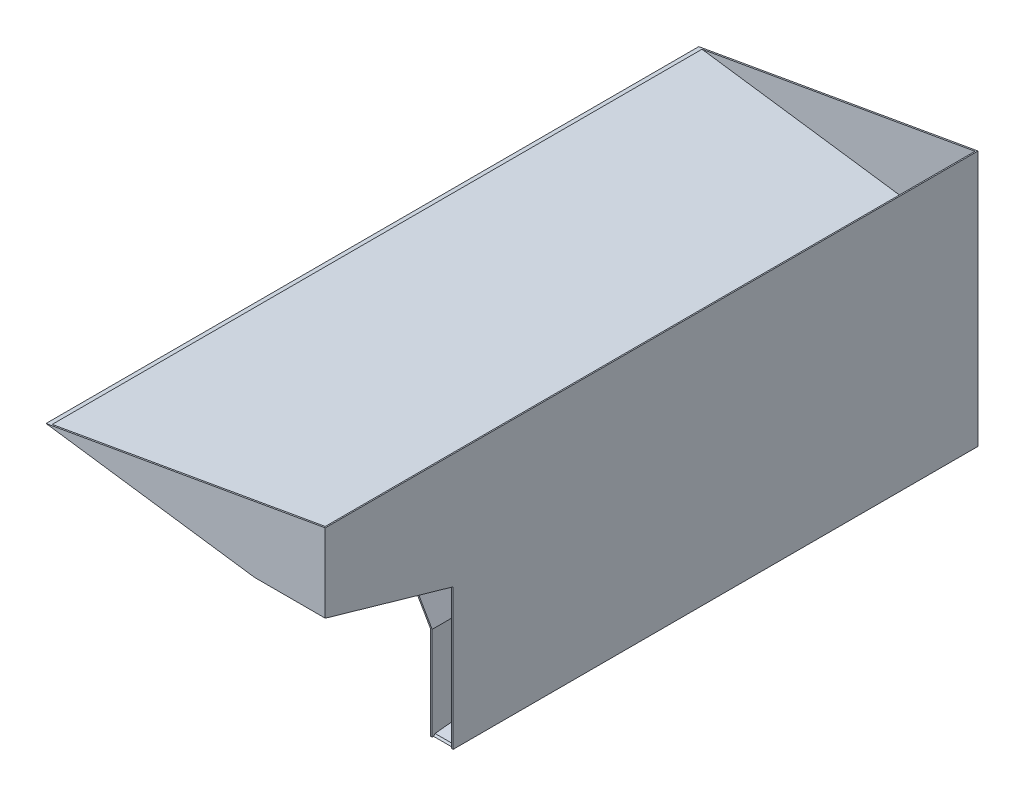
ISO-10303-21;
HEADER;
FILE_DESCRIPTION(('STEP AP214'),'2;1');
FILE_NAME('part.step','',(''),(''),'','','');
FILE_SCHEMA(('AUTOMOTIVE_DESIGN { 1 0 10303 214 1 1 1 1 }'));
ENDSEC;
DATA;
#1=APPLICATION_CONTEXT('core data for automotive mechanical design processes');
#2=APPLICATION_PROTOCOL_DEFINITION('international standard','automotive_design',2000,#1);
#3=PRODUCT_CONTEXT('',#1,'mechanical');
#4=PRODUCT('Part','Part','',(#3));
#5=PRODUCT_RELATED_PRODUCT_CATEGORY('part','',(#4));
#6=PRODUCT_DEFINITION_FORMATION('','',#4);
#7=PRODUCT_DEFINITION_CONTEXT('part definition',#1,'design');
#8=PRODUCT_DEFINITION('design','',#6,#7);
#9=PRODUCT_DEFINITION_SHAPE('','',#8);
#10=(LENGTH_UNIT() NAMED_UNIT(*) SI_UNIT(.MILLI.,.METRE.));
#11=(NAMED_UNIT(*) PLANE_ANGLE_UNIT() SI_UNIT($,.RADIAN.));
#12=(NAMED_UNIT(*) SI_UNIT($,.STERADIAN.) SOLID_ANGLE_UNIT());
#13=UNCERTAINTY_MEASURE_WITH_UNIT(LENGTH_MEASURE(1.E-05),#10,'distance_accuracy_value','');
#14=(GEOMETRIC_REPRESENTATION_CONTEXT(3) GLOBAL_UNCERTAINTY_ASSIGNED_CONTEXT((#13)) GLOBAL_UNIT_ASSIGNED_CONTEXT((#10,
#11,#12)) REPRESENTATION_CONTEXT('',''));
#15=CARTESIAN_POINT('',(0.,0.,0.));
#16=DIRECTION('',(0.,0.,1.));
#17=DIRECTION('',(1.,0.,0.));
#18=AXIS2_PLACEMENT_3D('',#15,#16,#17);
#19=CARTESIAN_POINT('',(100.,-200.,426.675));
#20=DIRECTION('',(0.,0.,-1.));
#21=DIRECTION('',(-1.,0.,0.));
#22=AXIS2_PLACEMENT_3D('',#19,#20,#21);
#23=PLANE('',#22);
#24=DIRECTION('',(-1.,0.,0.));
#25=VECTOR('',#24,1.);
#26=CARTESIAN_POINT('',(100.,-200.,426.675));
#27=LINE('',#26,#25);
#28=CARTESIAN_POINT('',(3.175,-200.,426.675));
#29=VERTEX_POINT('',#28);
#30=CARTESIAN_POINT('',(0.,-200.,426.675));
#31=VERTEX_POINT('',#30);
#32=EDGE_CURVE('E441',#29,#31,#27,.T.);
#33=ORIENTED_EDGE('',*,*,#32,.F.);
#34=DIRECTION('',(0.,1.,0.));
#35=VECTOR('',#34,1.);
#36=CARTESIAN_POINT('',(3.175,-200.,426.675));
#37=LINE('',#36,#35);
#38=CARTESIAN_POINT('',(3.175,0.850738685968816,426.675));
#39=VERTEX_POINT('',#38);
#40=EDGE_CURVE('E440',#29,#39,#37,.T.);
#41=ORIENTED_EDGE('',*,*,#40,.T.);
#42=DIRECTION('',(-0.500000000000001,0.866025403784438,0.));
#43=VECTOR('',#42,1.);
#44=CARTESIAN_POINT('',(2.74963065701559,1.5875,426.675));
#45=LINE('',#44,#43);
#46=CARTESIAN_POINT('',(-55.6276984364206,102.7,426.675));
#47=VERTEX_POINT('',#46);
#48=EDGE_CURVE('E333',#39,#47,#45,.T.);
#49=ORIENTED_EDGE('',*,*,#48,.T.);
#50=DIRECTION('',(-1.,0.,0.));
#51=VECTOR('',#50,1.);
#52=CARTESIAN_POINT('',(100.,102.7,426.675));
#53=LINE('',#52,#51);
#54=CARTESIAN_POINT('',(-59.2938726457747,102.7,426.675));
#55=VERTEX_POINT('',#54);
#56=EDGE_CURVE('E435',#47,#55,#53,.T.);
#57=ORIENTED_EDGE('',*,*,#56,.T.);
#58=DIRECTION('',(-0.500000000000001,0.866025403784438,0.));
#59=VECTOR('',#58,1.);
#60=CARTESIAN_POINT('',(0.,0.,426.675));
#61=LINE('',#60,#59);
#62=CARTESIAN_POINT('',(0.,0.,426.675));
#63=VERTEX_POINT('',#62);
#64=EDGE_CURVE('E450',#63,#55,#61,.T.);
#65=ORIENTED_EDGE('',*,*,#64,.F.);
#66=DIRECTION('',(0.,1.,0.));
#67=VECTOR('',#66,1.);
#68=CARTESIAN_POINT('',(0.,-200.,426.675));
#69=LINE('',#68,#67);
#70=EDGE_CURVE('E454',#31,#63,#69,.T.);
#71=ORIENTED_EDGE('',*,*,#70,.F.);
#72=EDGE_LOOP('',(#33,#41,#49,#57,#65,#71));
#73=FACE_BOUND('',#72,.T.);
#74=ADVANCED_FACE('F47',(#73),#23,.F.);
#75=CARTESIAN_POINT('',(0.,0.,698.5));
#76=DIRECTION('',(0.,0.,1.));
#77=DIRECTION('',(1.,0.,0.));
#78=AXIS2_PLACEMENT_3D('',#75,#76,#77);
#79=PLANE('',#78);
#80=DIRECTION('',(-1.,0.,0.));
#81=VECTOR('',#80,1.);
#82=CARTESIAN_POINT('',(0.,187.394734297147,698.5));
#83=LINE('',#82,#81);
#84=CARTESIAN_POINT('',(45.175,187.394734297147,698.5));
#85=VERTEX_POINT('',#84);
#86=CARTESIAN_POINT('',(-104.668740211988,187.394734297147,698.5));
#87=VERTEX_POINT('',#86);
#88=EDGE_CURVE('E421',#85,#87,#83,.T.);
#89=ORIENTED_EDGE('',*,*,#88,.T.);
#90=DIRECTION('',(0.0439713427708149,-0.999032792762546,0.));
#91=VECTOR('',#90,1.);
#92=CARTESIAN_POINT('',(-96.2343370929632,-4.23564977375333,698.5));
#93=LINE('',#92,#91);
#94=CARTESIAN_POINT('',(-104.563788725137,185.010227243083,698.5));
#95=VERTEX_POINT('',#94);
#96=EDGE_CURVE('E402',#87,#95,#93,.T.);
#97=ORIENTED_EDGE('',*,*,#96,.T.);
#98=DIRECTION('',(0.990432714403848,-0.137996515313345,0.));
#99=VECTOR('',#98,1.);
#100=CARTESIAN_POINT('',(-104.56186106388,185.009958662964,698.5));
#101=LINE('',#100,#99);
#102=CARTESIAN_POINT('',(-541.833243012971,245.93477069479,698.5));
#103=VERTEX_POINT('',#102);
#104=EDGE_CURVE('E247',#103,#95,#101,.T.);
#105=ORIENTED_EDGE('',*,*,#104,.F.);
#106=DIRECTION('',(-0.984807753012207,-0.173648177666935,0.));
#107=VECTOR('',#106,1.);
#108=CARTESIAN_POINT('',(-551.988806236242,244.144070894237,698.5));
#109=LINE('',#108,#107);
#110=CARTESIAN_POINT('',(45.1749999999999,349.440161836251,698.5));
#111=VERTEX_POINT('',#110);
#112=EDGE_CURVE('E257',#111,#103,#109,.T.);
#113=ORIENTED_EDGE('',*,*,#112,.F.);
#114=DIRECTION('',(0.,1.,0.));
#115=VECTOR('',#114,1.);
#116=CARTESIAN_POINT('',(45.1749999999999,350.,698.5));
#117=LINE('',#116,#115);
#118=EDGE_CURVE('E254',#85,#111,#117,.T.);
#119=ORIENTED_EDGE('',*,*,#118,.F.);
#120=EDGE_LOOP('',(#89,#97,#105,#113,#119));
#121=FACE_BOUND('',#120,.T.);
#122=ADVANCED_FACE('F534',(#121),#79,.F.);
#123=CARTESIAN_POINT('',(48.3499999999999,350.,701.675));
#124=DIRECTION('',(-1.,0.,0.));
#125=DIRECTION('',(0.,-1.,0.));
#126=AXIS2_PLACEMENT_3D('',#123,#124,#125);
#127=PLANE('',#126);
#128=DIRECTION('',(0.,-0.276105657594725,-0.961127289095562));
#129=VECTOR('',#128,1.);
#130=CARTESIAN_POINT('',(48.35,-18.3571552903526,5.27351006522856));
#131=LINE('',#130,#129);
#132=CARTESIAN_POINT('',(48.35,181.7,701.675));
#133=VERTEX_POINT('',#132);
#134=CARTESIAN_POINT('',(48.35,102.7,426.675));
#135=VERTEX_POINT('',#134);
#136=EDGE_CURVE('E424',#133,#135,#131,.T.);
#137=ORIENTED_EDGE('',*,*,#136,.T.);
#138=DIRECTION('',(0.,-1.,0.));
#139=VECTOR('',#138,1.);
#140=CARTESIAN_POINT('',(48.3499999999999,350.,426.675));
#141=LINE('',#140,#139);
#142=CARTESIAN_POINT('',(48.35,-200.,426.675));
#143=VERTEX_POINT('',#142);
#144=EDGE_CURVE('E457',#135,#143,#141,.T.);
#145=ORIENTED_EDGE('',*,*,#144,.T.);
#146=DIRECTION('',(0.,0.,-1.));
#147=VECTOR('',#146,1.);
#148=CARTESIAN_POINT('',(48.35,-200.,701.675));
#149=LINE('',#148,#147);
#150=CARTESIAN_POINT('',(48.35,-200.,-701.675));
#151=VERTEX_POINT('',#150);
#152=EDGE_CURVE('E327',#143,#151,#149,.T.);
#153=ORIENTED_EDGE('',*,*,#152,.T.);
#154=DIRECTION('',(0.,1.,0.));
#155=VECTOR('',#154,1.);
#156=CARTESIAN_POINT('',(48.3499999999999,350.,-701.675));
#157=LINE('',#156,#155);
#158=CARTESIAN_POINT('',(48.3499999999999,350.,-701.675));
#159=VERTEX_POINT('',#158);
#160=EDGE_CURVE('E301',#151,#159,#157,.T.);
#161=ORIENTED_EDGE('',*,*,#160,.T.);
#162=DIRECTION('',(0.,0.,-1.));
#163=VECTOR('',#162,1.);
#164=CARTESIAN_POINT('',(48.3499999999999,350.,701.675));
#165=LINE('',#164,#163);
#166=CARTESIAN_POINT('',(48.3499999999999,350.,701.675));
#167=VERTEX_POINT('',#166);
#168=EDGE_CURVE('E323',#167,#159,#165,.T.);
#169=ORIENTED_EDGE('',*,*,#168,.F.);
#170=DIRECTION('',(0.,1.,0.));
#171=VECTOR('',#170,1.);
#172=CARTESIAN_POINT('',(48.3499999999999,350.,701.675));
#173=LINE('',#172,#171);
#174=EDGE_CURVE('E283',#133,#167,#173,.T.);
#175=ORIENTED_EDGE('',*,*,#174,.F.);
#176=EDGE_LOOP('',(#137,#145,#153,#161,#169,#175));
#177=FACE_BOUND('',#176,.T.);
#178=ADVANCED_FACE('F514',(#177),#127,.F.);
#179=CARTESIAN_POINT('',(0.,0.,701.675));
#180=DIRECTION('',(0.866025403784438,0.500000000000001,0.));
#181=DIRECTION('',(-0.500000000000001,0.866025403784438,0.));
#182=AXIS2_PLACEMENT_3D('',#179,#180,#181);
#183=PLANE('',#182);
#184=DIRECTION('',(0.15742206253362,-0.272663010540513,-0.94914339112204));
#185=VECTOR('',#184,1.);
#186=CARTESIAN_POINT('',(-94.5056897461453,163.688656244664,638.977284395983));
#187=LINE('',#186,#185);
#188=CARTESIAN_POINT('',(-104.904543911755,181.7,701.675));
#189=VERTEX_POINT('',#188);
#190=EDGE_CURVE('E432',#189,#55,#187,.T.);
#191=ORIENTED_EDGE('',*,*,#190,.F.);
#192=DIRECTION('',(0.500000000000001,-0.866025403784438,0.));
#193=VECTOR('',#192,1.);
#194=CARTESIAN_POINT('',(0.,0.,701.675));
#195=LINE('',#194,#193);
#196=CARTESIAN_POINT('',(-105.,181.865334794732,701.675));
#197=VERTEX_POINT('',#196);
#198=EDGE_CURVE('E293',#197,#189,#195,.T.);
#199=ORIENTED_EDGE('',*,*,#198,.F.);
#200=DIRECTION('',(0.,0.,-1.));
#201=VECTOR('',#200,1.);
#202=CARTESIAN_POINT('',(-105.,181.865334794732,701.675));
#203=LINE('',#202,#201);
#204=CARTESIAN_POINT('',(-105.,181.865334794732,-701.675));
#205=VERTEX_POINT('',#204);
#206=EDGE_CURVE('E315',#197,#205,#203,.T.);
#207=ORIENTED_EDGE('',*,*,#206,.T.);
#208=DIRECTION('',(0.500000000000001,-0.866025403784438,0.));
#209=VECTOR('',#208,1.);
#210=CARTESIAN_POINT('',(0.,0.,-701.675));
#211=LINE('',#210,#209);
#212=CARTESIAN_POINT('',(0.,0.,-701.675));
#213=VERTEX_POINT('',#212);
#214=EDGE_CURVE('E287',#205,#213,#211,.T.);
#215=ORIENTED_EDGE('',*,*,#214,.T.);
#216=DIRECTION('',(0.,0.,-1.));
#217=VECTOR('',#216,1.);
#218=CARTESIAN_POINT('',(0.,0.,701.675));
#219=LINE('',#218,#217);
#220=EDGE_CURVE('E296',#63,#213,#219,.T.);
#221=ORIENTED_EDGE('',*,*,#220,.F.);
#222=ORIENTED_EDGE('',*,*,#64,.T.);
#223=EDGE_LOOP('',(#191,#199,#207,#215,#221,#222));
#224=FACE_BOUND('',#223,.T.);
#225=ADVANCED_FACE('F485',(#224),#183,.F.);
#226=CARTESIAN_POINT('',(0.,0.,701.675));
#227=DIRECTION('',(0.,0.,1.));
#228=DIRECTION('',(1.,0.,0.));
#229=AXIS2_PLACEMENT_3D('',#226,#227,#228);
#230=PLANE('',#229);
#231=ORIENTED_EDGE('',*,*,#198,.T.);
#232=DIRECTION('',(1.,0.,0.));
#233=VECTOR('',#232,1.);
#234=CARTESIAN_POINT('',(-551.988806236242,181.7,701.675));
#235=LINE('',#234,#233);
#236=EDGE_CURVE('E428',#189,#133,#235,.T.);
#237=ORIENTED_EDGE('',*,*,#236,.T.);
#238=ORIENTED_EDGE('',*,*,#174,.T.);
#239=DIRECTION('',(-0.984807753012207,-0.173648177666935,0.));
#240=VECTOR('',#239,1.);
#241=CARTESIAN_POINT('',(-551.988806236242,244.144070894237,701.675));
#242=LINE('',#241,#240);
#243=CARTESIAN_POINT('',(-551.988806236242,244.144070894237,701.675));
#244=VERTEX_POINT('',#243);
#245=EDGE_CURVE('E286',#167,#244,#242,.T.);
#246=ORIENTED_EDGE('',*,*,#245,.T.);
#247=DIRECTION('',(0.990432714403848,-0.137996515313345,0.));
#248=VECTOR('',#247,1.);
#249=CARTESIAN_POINT('',(-105.,181.865334794732,701.675));
#250=LINE('',#249,#248);
#251=EDGE_CURVE('E290',#244,#197,#250,.T.);
#252=ORIENTED_EDGE('',*,*,#251,.T.);
#253=EDGE_LOOP('',(#231,#237,#238,#246,#252));
#254=FACE_BOUND('',#253,.T.);
#255=ADVANCED_FACE('F488',(#254),#230,.T.);
#256=CARTESIAN_POINT('',(45.1749999999999,350.,701.675));
#257=DIRECTION('',(-1.,0.,0.));
#258=DIRECTION('',(0.,-1.,0.));
#259=AXIS2_PLACEMENT_3D('',#256,#257,#258);
#260=PLANE('',#259);
#261=DIRECTION('',(0.,-0.104528463267647,0.994521895368274));
#262=VECTOR('',#261,1.);
#263=CARTESIAN_POINT('',(45.175,-150.319090417385,-15.7991730441503));
#264=LINE('',#263,#262);
#265=CARTESIAN_POINT('',(45.175,-79.5654599258556,-688.975));
#266=VERTEX_POINT('',#265);
#267=CARTESIAN_POINT('',(45.175,-196.16124425825,420.359785964411));
#268=VERTEX_POINT('',#267);
#269=EDGE_CURVE('E362',#266,#268,#264,.T.);
#270=ORIENTED_EDGE('',*,*,#269,.T.);
#271=DIRECTION('',(0.,-0.777145961456969,0.62932039104984));
#272=VECTOR('',#271,1.);
#273=CARTESIAN_POINT('',(45.175,-203.959884113709,426.675));
#274=LINE('',#273,#272);
#275=CARTESIAN_POINT('',(45.175,-200.,423.468349071416));
#276=VERTEX_POINT('',#275);
#277=EDGE_CURVE('E11',#268,#276,#274,.T.);
#278=ORIENTED_EDGE('',*,*,#277,.T.);
#279=DIRECTION('',(0.,0.,-1.));
#280=VECTOR('',#279,1.);
#281=CARTESIAN_POINT('',(45.175,-200.,701.675));
#282=LINE('',#281,#280);
#283=CARTESIAN_POINT('',(45.175,-200.,426.675));
#284=VERTEX_POINT('',#283);
#285=EDGE_CURVE('E341',#284,#276,#282,.T.);
#286=ORIENTED_EDGE('',*,*,#285,.F.);
#287=DIRECTION('',(0.,-1.,0.));
#288=VECTOR('',#287,1.);
#289=CARTESIAN_POINT('',(45.1749999999999,350.,426.675));
#290=LINE('',#289,#288);
#291=CARTESIAN_POINT('',(45.175,102.7,426.675));
#292=VERTEX_POINT('',#291);
#293=EDGE_CURVE('E64',#292,#284,#290,.T.);
#294=ORIENTED_EDGE('',*,*,#293,.F.);
#295=DIRECTION('',(0.,-0.961127289095562,0.276105657594725));
#296=VECTOR('',#295,1.);
#297=CARTESIAN_POINT('',(45.175,258.169761561576,382.012777587765));
#298=LINE('',#297,#296);
#299=CARTESIAN_POINT('',(45.175,108.803158285757,424.921729074274));
#300=VERTEX_POINT('',#299);
#301=EDGE_CURVE('E409',#300,#292,#298,.T.);
#302=ORIENTED_EDGE('',*,*,#301,.F.);
#303=DIRECTION('',(0.,-0.276105657594725,-0.961127289095562));
#304=VECTOR('',#303,1.);
#305=CARTESIAN_POINT('',(45.175,200.63339672418,744.583951486508));
#306=LINE('',#305,#304);
#307=EDGE_CURVE('E417',#85,#300,#306,.T.);
#308=ORIENTED_EDGE('',*,*,#307,.F.);
#309=ORIENTED_EDGE('',*,*,#118,.T.);
#310=DIRECTION('',(0.,0.,-1.));
#311=VECTOR('',#310,1.);
#312=CARTESIAN_POINT('',(45.175,349.440161836251,701.675));
#313=LINE('',#312,#311);
#314=CARTESIAN_POINT('',(45.1749999999999,349.440161836251,-698.5));
#315=VERTEX_POINT('',#314);
#316=EDGE_CURVE('E237',#111,#315,#313,.T.);
#317=ORIENTED_EDGE('',*,*,#316,.T.);
#318=DIRECTION('',(0.,1.,0.));
#319=VECTOR('',#318,1.);
#320=CARTESIAN_POINT('',(45.1749999999999,350.,-698.5));
#321=LINE('',#320,#319);
#322=CARTESIAN_POINT('',(45.175,-196.825,-698.5));
#323=VERTEX_POINT('',#322);
#324=EDGE_CURVE('E249',#323,#315,#321,.T.);
#325=ORIENTED_EDGE('',*,*,#324,.F.);
#326=DIRECTION('',(0.,0.,-1.));
#327=VECTOR('',#326,1.);
#328=CARTESIAN_POINT('',(45.175,-196.825,701.675));
#329=LINE('',#328,#327);
#330=CARTESIAN_POINT('',(45.175,-196.825,396.466892857841));
#331=VERTEX_POINT('',#330);
#332=EDGE_CURVE('E230',#331,#323,#329,.T.);
#333=ORIENTED_EDGE('',*,*,#332,.F.);
#334=DIRECTION('',(0.,0.104528463267647,-0.994521895368274));
#335=VECTOR('',#334,1.);
#336=CARTESIAN_POINT('',(45.175,-153.45939973355,-16.1292328533235));
#337=LINE('',#336,#335);
#338=CARTESIAN_POINT('',(45.1750000000004,-82.7404599258556,-688.975));
#339=VERTEX_POINT('',#338);
#340=EDGE_CURVE('E208',#331,#339,#337,.T.);
#341=ORIENTED_EDGE('',*,*,#340,.T.);
#342=DIRECTION('',(0.,1.,0.));
#343=VECTOR('',#342,1.);
#344=CARTESIAN_POINT('',(45.175,-1.41527611864145E-13,-688.975));
#345=LINE('',#344,#343);
#346=EDGE_CURVE('E369',#339,#266,#345,.T.);
#347=ORIENTED_EDGE('',*,*,#346,.T.);
#348=EDGE_LOOP('',(#270,#278,#286,#294,#302,#308,#309,#317,#325,#333,#341,#347));
#349=FACE_BOUND('',#348,.T.);
#350=ADVANCED_FACE('F367',(#349),#260,.T.);
#351=CARTESIAN_POINT('',(2.74963065701559,1.5875,701.675));
#352=DIRECTION('',(0.866025403784438,0.500000000000001,0.));
#353=DIRECTION('',(-0.500000000000001,0.866025403784438,0.));
#354=AXIS2_PLACEMENT_3D('',#351,#352,#353);
#355=PLANE('',#354);
#356=DIRECTION('',(-0.48520959108948,0.840407664086696,-0.241426201683087));
#357=VECTOR('',#356,1.);
#358=CARTESIAN_POINT('',(31.5611488573092,-48.3155133661038,470.057638385172));
#359=LINE('',#358,#357);
#360=CARTESIAN_POINT('',(-59.1513585156092,108.803158285757,424.921729074274));
#361=VERTEX_POINT('',#360);
#362=EDGE_CURVE('E405',#47,#361,#359,.T.);
#363=ORIENTED_EDGE('',*,*,#362,.F.);
#364=ORIENTED_EDGE('',*,*,#48,.F.);
#365=DIRECTION('',(0.,0.,-1.));
#366=VECTOR('',#365,1.);
#367=CARTESIAN_POINT('',(3.175,0.850738685968816,701.675));
#368=LINE('',#367,#366);
#369=CARTESIAN_POINT('',(3.175,0.850738685968816,-698.5));
#370=VERTEX_POINT('',#369);
#371=EDGE_CURVE('E243',#39,#370,#368,.T.);
#372=ORIENTED_EDGE('',*,*,#371,.T.);
#373=DIRECTION('',(0.500000000000001,-0.866025403784438,0.));
#374=VECTOR('',#373,1.);
#375=CARTESIAN_POINT('',(2.74963065701559,1.5875,-698.5));
#376=LINE('',#375,#374);
#377=CARTESIAN_POINT('',(-103.025812507428,184.795941753931,-698.5));
#378=VERTEX_POINT('',#377);
#379=EDGE_CURVE('E258',#378,#370,#376,.T.);
#380=ORIENTED_EDGE('',*,*,#379,.F.);
#381=DIRECTION('',(0.,0.,-1.));
#382=VECTOR('',#381,1.);
#383=CARTESIAN_POINT('',(-103.025812507429,184.795941753931,701.675));
#384=LINE('',#383,#382);
#385=CARTESIAN_POINT('',(-103.025812507429,184.795941753931,689.453570260955));
#386=VERTEX_POINT('',#385);
#387=EDGE_CURVE('E246',#386,#378,#384,.T.);
#388=ORIENTED_EDGE('',*,*,#387,.F.);
#389=DIRECTION('',(-0.15742206253362,0.272663010540513,0.94914339112204));
#390=VECTOR('',#389,1.);
#391=CARTESIAN_POINT('',(-94.3667073592219,169.797931689156,637.245307377244));
#392=LINE('',#391,#390);
#393=EDGE_CURVE('E413',#361,#386,#392,.T.);
#394=ORIENTED_EDGE('',*,*,#393,.F.);
#395=EDGE_LOOP('',(#363,#364,#372,#380,#388,#394));
#396=FACE_BOUND('',#395,.T.);
#397=ADVANCED_FACE('F471',(#396),#355,.T.);
#398=CARTESIAN_POINT('',(-551.988806236242,244.144070894237,701.675));
#399=DIRECTION('',(0.173648177666935,-0.984807753012207,0.));
#400=DIRECTION('',(0.984807753012207,0.173648177666935,0.));
#401=AXIS2_PLACEMENT_3D('',#398,#399,#400);
#402=PLANE('',#401);
#403=DIRECTION('',(-0.984807753012207,-0.173648177666935,0.));
#404=VECTOR('',#403,1.);
#405=CARTESIAN_POINT('',(-551.988806236242,244.144070894237,-701.675));
#406=LINE('',#405,#404);
#407=CARTESIAN_POINT('',(-551.988806236242,244.144070894237,-701.675));
#408=VERTEX_POINT('',#407);
#409=EDGE_CURVE('E304',#159,#408,#406,.T.);
#410=ORIENTED_EDGE('',*,*,#409,.T.);
#411=DIRECTION('',(0.,0.,-1.));
#412=VECTOR('',#411,1.);
#413=CARTESIAN_POINT('',(-551.988806236242,244.144070894237,701.675));
#414=LINE('',#413,#412);
#415=EDGE_CURVE('E319',#244,#408,#414,.T.);
#416=ORIENTED_EDGE('',*,*,#415,.F.);
#417=ORIENTED_EDGE('',*,*,#245,.F.);
#418=ORIENTED_EDGE('',*,*,#168,.T.);
#419=EDGE_LOOP('',(#410,#416,#417,#418));
#420=FACE_BOUND('',#419,.T.);
#421=DIRECTION('',(-0.984807753012207,-0.173648177666935,0.));
#422=VECTOR('',#421,1.);
#423=CARTESIAN_POINT('',(-551.988806236242,244.144070894237,-698.5));
#424=LINE('',#423,#422);
#425=CARTESIAN_POINT('',(-541.833243012971,245.93477069479,-698.5));
#426=VERTEX_POINT('',#425);
#427=EDGE_CURVE('E253',#315,#426,#424,.T.);
#428=ORIENTED_EDGE('',*,*,#427,.F.);
#429=ORIENTED_EDGE('',*,*,#316,.F.);
#430=ORIENTED_EDGE('',*,*,#112,.T.);
#431=DIRECTION('',(0.,0.,-1.));
#432=VECTOR('',#431,1.);
#433=CARTESIAN_POINT('',(-541.833243012971,245.93477069479,701.675));
#434=LINE('',#433,#432);
#435=EDGE_CURVE('E268',#103,#426,#434,.T.);
#436=ORIENTED_EDGE('',*,*,#435,.T.);
#437=EDGE_LOOP('',(#428,#429,#430,#436));
#438=FACE_BOUND('',#437,.T.);
#439=ADVANCED_FACE('F517',(#420,#438),#402,.F.);
#440=CARTESIAN_POINT('',(0.,-200.,701.675));
#441=DIRECTION('',(1.,0.,0.));
#442=DIRECTION('',(0.,0.,-1.));
#443=AXIS2_PLACEMENT_3D('',#440,#441,#442);
#444=PLANE('',#443);
#445=DIRECTION('',(0.,0.,-1.));
#446=VECTOR('',#445,1.);
#447=CARTESIAN_POINT('',(0.,-200.,701.675));
#448=LINE('',#447,#446);
#449=CARTESIAN_POINT('',(0.,-200.,-701.675));
#450=VERTEX_POINT('',#449);
#451=EDGE_CURVE('E330',#31,#450,#448,.T.);
#452=ORIENTED_EDGE('',*,*,#451,.F.);
#453=ORIENTED_EDGE('',*,*,#70,.T.);
#454=ORIENTED_EDGE('',*,*,#220,.T.);
#455=DIRECTION('',(0.,-1.,0.));
#456=VECTOR('',#455,1.);
#457=CARTESIAN_POINT('',(0.,-200.,-701.675));
#458=LINE('',#457,#456);
#459=EDGE_CURVE('E229',#213,#450,#458,.T.);
#460=ORIENTED_EDGE('',*,*,#459,.T.);
#461=EDGE_LOOP('',(#452,#453,#454,#460));
#462=FACE_BOUND('',#461,.T.);
#463=ADVANCED_FACE('F506',(#462),#444,.F.);
#464=CARTESIAN_POINT('',(48.35,-200.,701.675));
#465=DIRECTION('',(0.,1.,0.));
#466=DIRECTION('',(0.,0.,1.));
#467=AXIS2_PLACEMENT_3D('',#464,#465,#466);
#468=PLANE('',#467);
#469=DIRECTION('',(-1.,0.,0.));
#470=VECTOR('',#469,1.);
#471=CARTESIAN_POINT('',(100.,-200.,423.468349071416));
#472=LINE('',#471,#470);
#473=CARTESIAN_POINT('',(3.17500000000003,-200.,423.468349071416));
#474=VERTEX_POINT('',#473);
#475=EDGE_CURVE('E345',#276,#474,#472,.T.);
#476=ORIENTED_EDGE('',*,*,#475,.T.);
#477=DIRECTION('',(0.,0.,1.));
#478=VECTOR('',#477,1.);
#479=CARTESIAN_POINT('',(3.175,-200.,701.675));
#480=LINE('',#479,#478);
#481=EDGE_CURVE('E349',#474,#29,#480,.T.);
#482=ORIENTED_EDGE('',*,*,#481,.T.);
#483=ORIENTED_EDGE('',*,*,#32,.T.);
#484=ORIENTED_EDGE('',*,*,#451,.T.);
#485=DIRECTION('',(1.,0.,0.));
#486=VECTOR('',#485,1.);
#487=CARTESIAN_POINT('',(48.35,-200.,-701.675));
#488=LINE('',#487,#486);
#489=EDGE_CURVE('E235',#450,#151,#488,.T.);
#490=ORIENTED_EDGE('',*,*,#489,.T.);
#491=ORIENTED_EDGE('',*,*,#152,.F.);
#492=EDGE_CURVE('E436',#143,#284,#27,.T.);
#493=ORIENTED_EDGE('',*,*,#492,.T.);
#494=ORIENTED_EDGE('',*,*,#285,.T.);
#495=EDGE_LOOP('',(#476,#482,#483,#484,#490,#491,#493,#494));
#496=FACE_BOUND('',#495,.T.);
#497=ADVANCED_FACE('F513',(#496),#468,.F.);
#498=CARTESIAN_POINT('',(-105.,181.865334794732,701.675));
#499=DIRECTION('',(0.137996515313345,0.990432714403848,0.));
#500=DIRECTION('',(-0.990432714403848,0.137996515313345,0.));
#501=AXIS2_PLACEMENT_3D('',#498,#499,#500);
#502=PLANE('',#501);
#503=DIRECTION('',(0.990432714403848,-0.137996515313345,0.));
#504=VECTOR('',#503,1.);
#505=CARTESIAN_POINT('',(-105.,181.865334794732,-701.675));
#506=LINE('',#505,#504);
#507=EDGE_CURVE('E307',#408,#205,#506,.T.);
#508=ORIENTED_EDGE('',*,*,#507,.T.);
#509=ORIENTED_EDGE('',*,*,#206,.F.);
#510=ORIENTED_EDGE('',*,*,#251,.F.);
#511=ORIENTED_EDGE('',*,*,#415,.T.);
#512=EDGE_LOOP('',(#508,#509,#510,#511));
#513=FACE_BOUND('',#512,.T.);
#514=ADVANCED_FACE('F495',(#513),#502,.F.);
#515=CARTESIAN_POINT('',(0.,0.,-701.675));
#516=DIRECTION('',(0.,0.,1.));
#517=DIRECTION('',(1.,0.,0.));
#518=AXIS2_PLACEMENT_3D('',#515,#516,#517);
#519=PLANE('',#518);
#520=ORIENTED_EDGE('',*,*,#459,.F.);
#521=ORIENTED_EDGE('',*,*,#214,.F.);
#522=ORIENTED_EDGE('',*,*,#507,.F.);
#523=ORIENTED_EDGE('',*,*,#409,.F.);
#524=ORIENTED_EDGE('',*,*,#160,.F.);
#525=ORIENTED_EDGE('',*,*,#489,.F.);
#526=EDGE_LOOP('',(#520,#521,#522,#523,#524,#525));
#527=FACE_BOUND('',#526,.T.);
#528=ADVANCED_FACE('F500',(#527),#519,.F.);
#529=CARTESIAN_POINT('',(3.175,-200.,701.675));
#530=DIRECTION('',(1.,0.,0.));
#531=DIRECTION('',(0.,0.,-1.));
#532=AXIS2_PLACEMENT_3D('',#529,#530,#531);
#533=PLANE('',#532);
#534=ORIENTED_EDGE('',*,*,#40,.F.);
#535=ORIENTED_EDGE('',*,*,#481,.F.);
#536=DIRECTION('',(0.,0.777145961456969,-0.62932039104984));
#537=VECTOR('',#536,1.);
#538=CARTESIAN_POINT('',(3.175,-203.959884113709,426.675));
#539=LINE('',#538,#537);
#540=CARTESIAN_POINT('',(3.175,-196.16124425825,420.359785964411));
#541=VERTEX_POINT('',#540);
#542=EDGE_CURVE('E57',#474,#541,#539,.T.);
#543=ORIENTED_EDGE('',*,*,#542,.T.);
#544=DIRECTION('',(0.,0.104528463267647,-0.994521895368274));
#545=VECTOR('',#544,1.);
#546=CARTESIAN_POINT('',(3.175,-150.319090417385,-15.7991730441503));
#547=LINE('',#546,#545);
#548=CARTESIAN_POINT('',(3.175,-79.5654599258556,-688.975));
#549=VERTEX_POINT('',#548);
#550=EDGE_CURVE('E222',#541,#549,#547,.T.);
#551=ORIENTED_EDGE('',*,*,#550,.T.);
#552=DIRECTION('',(0.,-1.,0.));
#553=VECTOR('',#552,1.);
#554=CARTESIAN_POINT('',(3.175,0.,-688.975));
#555=LINE('',#554,#553);
#556=CARTESIAN_POINT('',(3.175,-82.7404599258556,-688.975));
#557=VERTEX_POINT('',#556);
#558=EDGE_CURVE('E220',#549,#557,#555,.T.);
#559=ORIENTED_EDGE('',*,*,#558,.T.);
#560=DIRECTION('',(0.,-0.104528463267647,0.994521895368274));
#561=VECTOR('',#560,1.);
#562=CARTESIAN_POINT('',(3.175,-153.45939973355,-16.1292328533235));
#563=LINE('',#562,#561);
#564=CARTESIAN_POINT('',(3.175,-196.825,396.466892857841));
#565=VERTEX_POINT('',#564);
#566=EDGE_CURVE('E205',#557,#565,#563,.T.);
#567=ORIENTED_EDGE('',*,*,#566,.T.);
#568=DIRECTION('',(0.,0.,-1.));
#569=VECTOR('',#568,1.);
#570=CARTESIAN_POINT('',(3.175,-196.825,701.675));
#571=LINE('',#570,#569);
#572=CARTESIAN_POINT('',(3.175,-196.825,-698.5));
#573=VERTEX_POINT('',#572);
#574=EDGE_CURVE('E217',#565,#573,#571,.T.);
#575=ORIENTED_EDGE('',*,*,#574,.T.);
#576=DIRECTION('',(0.,-1.,0.));
#577=VECTOR('',#576,1.);
#578=CARTESIAN_POINT('',(3.175,-200.,-698.5));
#579=LINE('',#578,#577);
#580=EDGE_CURVE('E241',#370,#573,#579,.T.);
#581=ORIENTED_EDGE('',*,*,#580,.F.);
#582=ORIENTED_EDGE('',*,*,#371,.F.);
#583=EDGE_LOOP('',(#534,#535,#543,#551,#559,#567,#575,#581,#582));
#584=FACE_BOUND('',#583,.T.);
#585=ADVANCED_FACE('F215',(#584),#533,.T.);
#586=CARTESIAN_POINT('',(48.35,-196.825,701.675));
#587=DIRECTION('',(0.,1.,0.));
#588=DIRECTION('',(0.,0.,1.));
#589=AXIS2_PLACEMENT_3D('',#586,#587,#588);
#590=PLANE('',#589);
#591=DIRECTION('',(-1.,0.,0.));
#592=VECTOR('',#591,1.);
#593=CARTESIAN_POINT('',(1166.97031209504,-196.825,396.466892857841));
#594=LINE('',#593,#592);
#595=EDGE_CURVE('E202',#331,#565,#594,.T.);
#596=ORIENTED_EDGE('',*,*,#595,.F.);
#597=ORIENTED_EDGE('',*,*,#332,.T.);
#598=DIRECTION('',(1.,0.,0.));
#599=VECTOR('',#598,1.);
#600=CARTESIAN_POINT('',(48.35,-196.825,-698.5));
#601=LINE('',#600,#599);
#602=EDGE_CURVE('E226',#573,#323,#601,.T.);
#603=ORIENTED_EDGE('',*,*,#602,.F.);
#604=ORIENTED_EDGE('',*,*,#574,.F.);
#605=EDGE_LOOP('',(#596,#597,#603,#604));
#606=FACE_BOUND('',#605,.T.);
#607=ADVANCED_FACE('F224',(#606),#590,.T.);
#608=CARTESIAN_POINT('',(-104.56186106388,185.009958662964,701.675));
#609=DIRECTION('',(0.137996515313345,0.990432714403848,0.));
#610=DIRECTION('',(-0.990432714403848,0.137996515313345,0.));
#611=AXIS2_PLACEMENT_3D('',#608,#609,#610);
#612=PLANE('',#611);
#613=DIRECTION('',(-0.152324283073309,0.0212232693407875,0.988102669576745));
#614=VECTOR('',#613,1.);
#615=CARTESIAN_POINT('',(-105.041618827563,185.076803082196,701.599605593316));
#616=LINE('',#615,#614);
#617=CARTESIAN_POINT('',(-103.180793618227,184.817535197805,689.528737312416));
#618=VERTEX_POINT('',#617);
#619=EDGE_CURVE('E395',#618,#95,#616,.T.);
#620=ORIENTED_EDGE('',*,*,#619,.F.);
#621=DIRECTION('',(-0.892769853816947,0.124389195764498,0.433000365002998));
#622=VECTOR('',#621,1.);
#623=CARTESIAN_POINT('',(-108.998302463062,185.628085916412,692.350274624022));
#624=LINE('',#623,#622);
#625=EDGE_CURVE('E337',#386,#618,#624,.T.);
#626=ORIENTED_EDGE('',*,*,#625,.F.);
#627=ORIENTED_EDGE('',*,*,#387,.T.);
#628=DIRECTION('',(0.990432714403848,-0.137996515313345,0.));
#629=VECTOR('',#628,1.);
#630=CARTESIAN_POINT('',(-104.56186106388,185.009958662964,-698.5));
#631=LINE('',#630,#629);
#632=EDGE_CURVE('E262',#426,#378,#631,.T.);
#633=ORIENTED_EDGE('',*,*,#632,.F.);
#634=ORIENTED_EDGE('',*,*,#435,.F.);
#635=ORIENTED_EDGE('',*,*,#104,.T.);
#636=EDGE_LOOP('',(#620,#626,#627,#633,#634,#635));
#637=FACE_BOUND('',#636,.T.);
#638=ADVANCED_FACE('F525',(#637),#612,.T.);
#639=CARTESIAN_POINT('',(0.,0.,-698.5));
#640=DIRECTION('',(0.,0.,1.));
#641=DIRECTION('',(1.,0.,0.));
#642=AXIS2_PLACEMENT_3D('',#639,#640,#641);
#643=PLANE('',#642);
#644=ORIENTED_EDGE('',*,*,#580,.T.);
#645=ORIENTED_EDGE('',*,*,#602,.T.);
#646=ORIENTED_EDGE('',*,*,#324,.T.);
#647=ORIENTED_EDGE('',*,*,#427,.T.);
#648=ORIENTED_EDGE('',*,*,#632,.T.);
#649=ORIENTED_EDGE('',*,*,#379,.T.);
#650=EDGE_LOOP('',(#644,#645,#646,#647,#648,#649));
#651=FACE_BOUND('',#650,.T.);
#652=ADVANCED_FACE('F465',(#651),#643,.T.);
#653=ORIENTED_EDGE('',*,*,#293,.T.);
#654=ORIENTED_EDGE('',*,*,#492,.F.);
#655=ORIENTED_EDGE('',*,*,#144,.F.);
#656=EDGE_CURVE('E445',#135,#292,#53,.T.);
#657=ORIENTED_EDGE('',*,*,#656,.T.);
#658=EDGE_LOOP('',(#653,#654,#655,#657));
#659=FACE_BOUND('',#658,.T.);
#660=ADVANCED_FACE('F511',(#659),#23,.F.);
#661=CARTESIAN_POINT('',(-551.988806236242,-18.3571552903526,5.27351006522856));
#662=DIRECTION('',(0.,-0.961127289095562,0.276105657594725));
#663=DIRECTION('',(0.,-0.276105657594725,-0.961127289095562));
#664=AXIS2_PLACEMENT_3D('',#661,#662,#663);
#665=PLANE('',#664);
#666=ORIENTED_EDGE('',*,*,#190,.T.);
#667=ORIENTED_EDGE('',*,*,#56,.F.);
#668=DIRECTION('',(1.,0.,0.));
#669=VECTOR('',#668,1.);
#670=CARTESIAN_POINT('',(48.35,102.7,426.675));
#671=LINE('',#670,#669);
#672=EDGE_CURVE('E374',#47,#292,#671,.T.);
#673=ORIENTED_EDGE('',*,*,#672,.T.);
#674=ORIENTED_EDGE('',*,*,#656,.F.);
#675=ORIENTED_EDGE('',*,*,#136,.F.);
#676=ORIENTED_EDGE('',*,*,#236,.F.);
#677=EDGE_LOOP('',(#666,#667,#673,#674,#675,#676));
#678=FACE_BOUND('',#677,.T.);
#679=ADVANCED_FACE('F481',(#678),#665,.T.);
#680=CARTESIAN_POINT('',(0.,-12.2539970045958,3.52023913950205));
#681=DIRECTION('',(0.,0.961127289095562,-0.276105657594725));
#682=DIRECTION('',(0.,0.276105657594725,0.961127289095562));
#683=AXIS2_PLACEMENT_3D('',#680,#681,#682);
#684=PLANE('',#683);
#685=ORIENTED_EDGE('',*,*,#88,.F.);
#686=ORIENTED_EDGE('',*,*,#307,.T.);
#687=DIRECTION('',(1.,0.,0.));
#688=VECTOR('',#687,1.);
#689=CARTESIAN_POINT('',(48.35,108.803158285757,424.921729074274));
#690=LINE('',#689,#688);
#691=EDGE_CURVE('E391',#361,#300,#690,.T.);
#692=ORIENTED_EDGE('',*,*,#691,.F.);
#693=ORIENTED_EDGE('',*,*,#393,.T.);
#694=ORIENTED_EDGE('',*,*,#625,.T.);
#695=DIRECTION('',(0.157422062533619,-0.272663010540513,-0.94914339112204));
#696=VECTOR('',#695,1.);
#697=CARTESIAN_POINT('',(-59.2938726457747,108.803158285757,424.921729074274));
#698=LINE('',#697,#696);
#699=EDGE_CURVE('E387',#87,#618,#698,.T.);
#700=ORIENTED_EDGE('',*,*,#699,.F.);
#701=EDGE_LOOP('',(#685,#686,#692,#693,#694,#700));
#702=FACE_BOUND('',#701,.T.);
#703=ADVANCED_FACE('F529',(#702),#684,.T.);
#704=CARTESIAN_POINT('',(-59.2938726457747,108.803158285757,424.921729074274));
#705=DIRECTION('',(-0.987531414299141,-0.043465122095763,-0.15130264020677));
#706=DIRECTION('',(-0.151445764781561,0.,0.988465568611132));
#707=AXIS2_PLACEMENT_3D('',#704,#705,#706);
#708=PLANE('',#707);
#709=ORIENTED_EDGE('',*,*,#96,.F.);
#710=ORIENTED_EDGE('',*,*,#699,.T.);
#711=ORIENTED_EDGE('',*,*,#619,.T.);
#712=EDGE_LOOP('',(#709,#710,#711));
#713=FACE_BOUND('',#712,.T.);
#714=ADVANCED_FACE('F537',(#713),#708,.T.);
#715=CARTESIAN_POINT('',(48.35,108.803158285757,424.921729074274));
#716=DIRECTION('',(0.,-0.276105657594725,-0.961127289095562));
#717=DIRECTION('',(0.,0.961127289095562,-0.276105657594725));
#718=AXIS2_PLACEMENT_3D('',#715,#716,#717);
#719=PLANE('',#718);
#720=ORIENTED_EDGE('',*,*,#691,.T.);
#721=ORIENTED_EDGE('',*,*,#301,.T.);
#722=ORIENTED_EDGE('',*,*,#672,.F.);
#723=ORIENTED_EDGE('',*,*,#362,.T.);
#724=EDGE_LOOP('',(#720,#721,#722,#723));
#725=FACE_BOUND('',#724,.T.);
#726=ADVANCED_FACE('F478',(#725),#719,.T.);
#727=CARTESIAN_POINT('',(1166.97031209504,-150.319090417385,-15.7991730441503));
#728=DIRECTION('',(0.,0.994521895368274,0.104528463267647));
#729=DIRECTION('',(0.,-0.104528463267647,0.994521895368274));
#730=AXIS2_PLACEMENT_3D('',#727,#728,#729);
#731=PLANE('',#730);
#732=ORIENTED_EDGE('',*,*,#550,.F.);
#733=DIRECTION('',(1.,0.,0.));
#734=VECTOR('',#733,1.);
#735=CARTESIAN_POINT('',(45.175,-196.16124425825,420.359785964411));
#736=LINE('',#735,#734);
#737=EDGE_CURVE('E353',#541,#268,#736,.T.);
#738=ORIENTED_EDGE('',*,*,#737,.T.);
#739=ORIENTED_EDGE('',*,*,#269,.F.);
#740=DIRECTION('',(-1.,0.,0.));
#741=VECTOR('',#740,1.);
#742=CARTESIAN_POINT('',(1166.97031209504,-79.5654599258556,-688.975));
#743=LINE('',#742,#741);
#744=EDGE_CURVE('E382',#266,#549,#743,.T.);
#745=ORIENTED_EDGE('',*,*,#744,.T.);
#746=EDGE_LOOP('',(#732,#738,#739,#745));
#747=FACE_BOUND('',#746,.T.);
#748=ADVANCED_FACE('F360',(#747),#731,.T.);
#749=CARTESIAN_POINT('',(1166.97031209504,-153.45939973355,-16.1292328533235));
#750=DIRECTION('',(0.,-0.994521895368274,-0.104528463267647));
#751=DIRECTION('',(0.,0.104528463267647,-0.994521895368274));
#752=AXIS2_PLACEMENT_3D('',#749,#750,#751);
#753=PLANE('',#752);
#754=ORIENTED_EDGE('',*,*,#340,.F.);
#755=ORIENTED_EDGE('',*,*,#595,.T.);
#756=ORIENTED_EDGE('',*,*,#566,.F.);
#757=DIRECTION('',(-1.,0.,0.));
#758=VECTOR('',#757,1.);
#759=CARTESIAN_POINT('',(1166.97031209504,-82.7404599258556,-688.975));
#760=LINE('',#759,#758);
#761=EDGE_CURVE('E213',#339,#557,#760,.T.);
#762=ORIENTED_EDGE('',*,*,#761,.F.);
#763=EDGE_LOOP('',(#754,#755,#756,#762));
#764=FACE_BOUND('',#763,.T.);
#765=ADVANCED_FACE('F204',(#764),#753,.T.);
#766=CARTESIAN_POINT('',(1166.97031209504,0.,-688.975));
#767=DIRECTION('',(0.,0.,-1.));
#768=DIRECTION('',(-1.,0.,0.));
#769=AXIS2_PLACEMENT_3D('',#766,#767,#768);
#770=PLANE('',#769);
#771=ORIENTED_EDGE('',*,*,#346,.F.);
#772=ORIENTED_EDGE('',*,*,#761,.T.);
#773=ORIENTED_EDGE('',*,*,#558,.F.);
#774=ORIENTED_EDGE('',*,*,#744,.F.);
#775=EDGE_LOOP('',(#771,#772,#773,#774));
#776=FACE_BOUND('',#775,.T.);
#777=ADVANCED_FACE('F659',(#776),#770,.T.);
#778=CARTESIAN_POINT('',(100.,-203.959884113709,426.675));
#779=DIRECTION('',(0.,0.62932039104984,0.777145961456969));
#780=DIRECTION('',(1.,0.,0.));
#781=AXIS2_PLACEMENT_3D('',#778,#779,#780);
#782=PLANE('',#781);
#783=ORIENTED_EDGE('',*,*,#277,.F.);
#784=ORIENTED_EDGE('',*,*,#737,.F.);
#785=ORIENTED_EDGE('',*,*,#542,.F.);
#786=ORIENTED_EDGE('',*,*,#475,.F.);
#787=EDGE_LOOP('',(#783,#784,#785,#786));
#788=FACE_BOUND('',#787,.T.);
#789=ADVANCED_FACE('F50',(#788),#782,.T.);
#790=CLOSED_SHELL('',(#74,#122,#178,#225,#255,#350,#397,#439,#463,#497,#514,#528,#585,#607,#638,
#652,#660,#679,#703,#714,#726,#748,#765,#777,#789));
#791=MANIFOLD_SOLID_BREP('B2',#790);
#792=ADVANCED_BREP_SHAPE_REPRESENTATION('',(#18,#791),#14);
#793=SHAPE_DEFINITION_REPRESENTATION(#9,#792);
ENDSEC;
END-ISO-10303-21;
